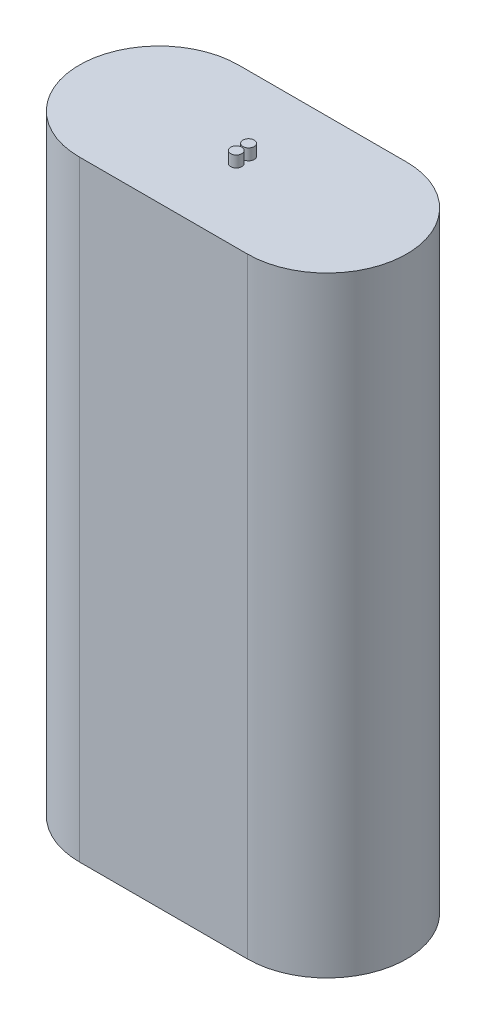
ISO-10303-21;
HEADER;
FILE_DESCRIPTION(('STEP AP214'),'2;1');
FILE_NAME('part.step','',(''),(''),'','','');
FILE_SCHEMA(('AUTOMOTIVE_DESIGN { 1 0 10303 214 1 1 1 1 }'));
ENDSEC;
DATA;
#1=APPLICATION_CONTEXT('core data for automotive mechanical design processes');
#2=APPLICATION_PROTOCOL_DEFINITION('international standard','automotive_design',2000,#1);
#3=PRODUCT_CONTEXT('',#1,'mechanical');
#4=PRODUCT('Part','Part','',(#3));
#5=PRODUCT_RELATED_PRODUCT_CATEGORY('part','',(#4));
#6=PRODUCT_DEFINITION_FORMATION('','',#4);
#7=PRODUCT_DEFINITION_CONTEXT('part definition',#1,'design');
#8=PRODUCT_DEFINITION('design','',#6,#7);
#9=PRODUCT_DEFINITION_SHAPE('','',#8);
#10=(LENGTH_UNIT() NAMED_UNIT(*) SI_UNIT(.MILLI.,.METRE.));
#11=(NAMED_UNIT(*) PLANE_ANGLE_UNIT() SI_UNIT($,.RADIAN.));
#12=(NAMED_UNIT(*) SI_UNIT($,.STERADIAN.) SOLID_ANGLE_UNIT());
#13=UNCERTAINTY_MEASURE_WITH_UNIT(LENGTH_MEASURE(1.E-05),#10,'distance_accuracy_value','');
#14=(GEOMETRIC_REPRESENTATION_CONTEXT(3) GLOBAL_UNCERTAINTY_ASSIGNED_CONTEXT((#13)) GLOBAL_UNIT_ASSIGNED_CONTEXT((#10,
#11,#12)) REPRESENTATION_CONTEXT('',''));
#15=CARTESIAN_POINT('',(0.,0.,0.));
#16=DIRECTION('',(0.,0.,1.));
#17=DIRECTION('',(1.,0.,0.));
#18=AXIS2_PLACEMENT_3D('',#15,#16,#17);
#19=CARTESIAN_POINT('',(0.,69.,-9.));
#20=DIRECTION('',(0.,-1.,0.));
#21=DIRECTION('',(0.,0.,-1.));
#22=AXIS2_PLACEMENT_3D('',#19,#20,#21);
#23=CYLINDRICAL_SURFACE('',#22,9.);
#24=CARTESIAN_POINT('',(0.,0.,-9.));
#25=DIRECTION('',(0.,1.,0.));
#26=DIRECTION('',(0.,0.,1.));
#27=AXIS2_PLACEMENT_3D('',#24,#25,#26);
#28=CIRCLE('',#27,9.);
#29=CARTESIAN_POINT('',(0.,0.,-18.));
#30=VERTEX_POINT('',#29);
#31=CARTESIAN_POINT('',(0.,0.,0.));
#32=VERTEX_POINT('',#31);
#33=EDGE_CURVE('E103',#30,#32,#28,.T.);
#34=ORIENTED_EDGE('',*,*,#33,.T.);
#35=DIRECTION('',(0.,-1.,0.));
#36=VECTOR('',#35,1.);
#37=CARTESIAN_POINT('',(0.,69.,0.));
#38=LINE('',#37,#36);
#39=CARTESIAN_POINT('',(0.,69.,0.));
#40=VERTEX_POINT('',#39);
#41=EDGE_CURVE('E11',#40,#32,#38,.T.);
#42=ORIENTED_EDGE('',*,*,#41,.F.);
#43=CARTESIAN_POINT('',(0.,69.,-9.));
#44=DIRECTION('',(0.,1.,0.));
#45=DIRECTION('',(0.,0.,1.));
#46=AXIS2_PLACEMENT_3D('',#43,#44,#45);
#47=CIRCLE('',#46,9.);
#48=CARTESIAN_POINT('',(0.,69.,-18.));
#49=VERTEX_POINT('',#48);
#50=EDGE_CURVE('E89',#49,#40,#47,.T.);
#51=ORIENTED_EDGE('',*,*,#50,.F.);
#52=DIRECTION('',(0.,-1.,0.));
#53=VECTOR('',#52,1.);
#54=CARTESIAN_POINT('',(0.,69.,-18.));
#55=LINE('',#54,#53);
#56=EDGE_CURVE('E56',#49,#30,#55,.T.);
#57=ORIENTED_EDGE('',*,*,#56,.T.);
#58=EDGE_LOOP('',(#34,#42,#51,#57));
#59=FACE_BOUND('',#58,.T.);
#60=ADVANCED_FACE('F40',(#59),#23,.T.);
#61=CARTESIAN_POINT('',(0.,69.,0.));
#62=DIRECTION('',(0.,0.,-1.));
#63=DIRECTION('',(-1.,0.,0.));
#64=AXIS2_PLACEMENT_3D('',#61,#62,#63);
#65=PLANE('',#64);
#66=DIRECTION('',(1.,0.,0.));
#67=VECTOR('',#66,1.);
#68=CARTESIAN_POINT('',(0.,0.,0.));
#69=LINE('',#68,#67);
#70=CARTESIAN_POINT('',(19.,0.,0.));
#71=VERTEX_POINT('',#70);
#72=EDGE_CURVE('E94',#32,#71,#69,.T.);
#73=ORIENTED_EDGE('',*,*,#72,.T.);
#74=DIRECTION('',(0.,-1.,0.));
#75=VECTOR('',#74,1.);
#76=CARTESIAN_POINT('',(19.,69.,0.));
#77=LINE('',#76,#75);
#78=CARTESIAN_POINT('',(19.,69.,0.));
#79=VERTEX_POINT('',#78);
#80=EDGE_CURVE('E48',#79,#71,#77,.T.);
#81=ORIENTED_EDGE('',*,*,#80,.F.);
#82=DIRECTION('',(1.,0.,0.));
#83=VECTOR('',#82,1.);
#84=CARTESIAN_POINT('',(0.,69.,0.));
#85=LINE('',#84,#83);
#86=EDGE_CURVE('E82',#40,#79,#85,.T.);
#87=ORIENTED_EDGE('',*,*,#86,.F.);
#88=ORIENTED_EDGE('',*,*,#41,.T.);
#89=EDGE_LOOP('',(#73,#81,#87,#88));
#90=FACE_BOUND('',#89,.T.);
#91=ADVANCED_FACE('F93',(#90),#65,.F.);
#92=CARTESIAN_POINT('',(19.,69.,-9.));
#93=DIRECTION('',(0.,-1.,0.));
#94=DIRECTION('',(0.,0.,-1.));
#95=AXIS2_PLACEMENT_3D('',#92,#93,#94);
#96=CYLINDRICAL_SURFACE('',#95,9.);
#97=CARTESIAN_POINT('',(19.,0.,-9.));
#98=DIRECTION('',(0.,1.,0.));
#99=DIRECTION('',(0.,0.,1.));
#100=AXIS2_PLACEMENT_3D('',#97,#98,#99);
#101=CIRCLE('',#100,9.);
#102=CARTESIAN_POINT('',(19.,0.,-18.));
#103=VERTEX_POINT('',#102);
#104=EDGE_CURVE('E107',#71,#103,#101,.T.);
#105=ORIENTED_EDGE('',*,*,#104,.T.);
#106=DIRECTION('',(0.,-1.,0.));
#107=VECTOR('',#106,1.);
#108=CARTESIAN_POINT('',(19.,69.,-18.));
#109=LINE('',#108,#107);
#110=CARTESIAN_POINT('',(19.,69.,-18.));
#111=VERTEX_POINT('',#110);
#112=EDGE_CURVE('E71',#111,#103,#109,.T.);
#113=ORIENTED_EDGE('',*,*,#112,.F.);
#114=CARTESIAN_POINT('',(19.,69.,-9.));
#115=DIRECTION('',(0.,1.,0.));
#116=DIRECTION('',(0.,0.,1.));
#117=AXIS2_PLACEMENT_3D('',#114,#115,#116);
#118=CIRCLE('',#117,9.);
#119=EDGE_CURVE('E88',#79,#111,#118,.T.);
#120=ORIENTED_EDGE('',*,*,#119,.F.);
#121=ORIENTED_EDGE('',*,*,#80,.T.);
#122=EDGE_LOOP('',(#105,#113,#120,#121));
#123=FACE_BOUND('',#122,.T.);
#124=ADVANCED_FACE('F97',(#123),#96,.T.);
#125=CARTESIAN_POINT('',(0.,69.,-18.));
#126=DIRECTION('',(0.,0.,-1.));
#127=DIRECTION('',(-1.,0.,0.));
#128=AXIS2_PLACEMENT_3D('',#125,#126,#127);
#129=PLANE('',#128);
#130=DIRECTION('',(1.,0.,0.));
#131=VECTOR('',#130,1.);
#132=CARTESIAN_POINT('',(0.,0.,-18.));
#133=LINE('',#132,#131);
#134=EDGE_CURVE('E109',#30,#103,#133,.T.);
#135=ORIENTED_EDGE('',*,*,#134,.F.);
#136=ORIENTED_EDGE('',*,*,#56,.F.);
#137=DIRECTION('',(1.,0.,0.));
#138=VECTOR('',#137,1.);
#139=CARTESIAN_POINT('',(0.,69.,-18.));
#140=LINE('',#139,#138);
#141=EDGE_CURVE('E98',#49,#111,#140,.T.);
#142=ORIENTED_EDGE('',*,*,#141,.T.);
#143=ORIENTED_EDGE('',*,*,#112,.T.);
#144=EDGE_LOOP('',(#135,#136,#142,#143));
#145=FACE_BOUND('',#144,.T.);
#146=ADVANCED_FACE('F139',(#145),#129,.T.);
#147=CARTESIAN_POINT('',(0.,69.,0.));
#148=DIRECTION('',(0.,1.,0.));
#149=DIRECTION('',(0.,0.,1.));
#150=AXIS2_PLACEMENT_3D('',#147,#148,#149);
#151=PLANE('',#150);
#152=CARTESIAN_POINT('',(9.5,69.,-8.238));
#153=DIRECTION('',(0.,1.,0.));
#154=DIRECTION('',(0.,0.,1.));
#155=AXIS2_PLACEMENT_3D('',#152,#153,#154);
#156=CIRCLE('',#155,0.635000000000001);
#157=CARTESIAN_POINT('',(9.5,69.,-7.603));
#158=VERTEX_POINT('',#157);
#159=EDGE_CURVE('E121',#158,#158,#156,.T.);
#160=ORIENTED_EDGE('',*,*,#159,.F.);
#161=EDGE_LOOP('',(#160));
#162=FACE_BOUND('',#161,.T.);
#163=CARTESIAN_POINT('',(9.5,69.,-9.635));
#164=DIRECTION('',(0.,1.,0.));
#165=DIRECTION('',(0.,0.,1.));
#166=AXIS2_PLACEMENT_3D('',#163,#164,#165);
#167=CIRCLE('',#166,0.635000000000001);
#168=CARTESIAN_POINT('',(9.5,69.,-9.));
#169=VERTEX_POINT('',#168);
#170=EDGE_CURVE('E115',#169,#169,#167,.T.);
#171=ORIENTED_EDGE('',*,*,#170,.F.);
#172=EDGE_LOOP('',(#171));
#173=FACE_BOUND('',#172,.T.);
#174=ORIENTED_EDGE('',*,*,#50,.T.);
#175=ORIENTED_EDGE('',*,*,#86,.T.);
#176=ORIENTED_EDGE('',*,*,#119,.T.);
#177=ORIENTED_EDGE('',*,*,#141,.F.);
#178=EDGE_LOOP('',(#174,#175,#176,#177));
#179=FACE_BOUND('',#178,.T.);
#180=ADVANCED_FACE('F85',(#162,#173,#179),#151,.T.);
#181=CARTESIAN_POINT('',(0.,0.,0.));
#182=DIRECTION('',(0.,1.,0.));
#183=DIRECTION('',(0.,0.,1.));
#184=AXIS2_PLACEMENT_3D('',#181,#182,#183);
#185=PLANE('',#184);
#186=ORIENTED_EDGE('',*,*,#33,.F.);
#187=ORIENTED_EDGE('',*,*,#134,.T.);
#188=ORIENTED_EDGE('',*,*,#104,.F.);
#189=ORIENTED_EDGE('',*,*,#72,.F.);
#190=EDGE_LOOP('',(#186,#187,#188,#189));
#191=FACE_BOUND('',#190,.T.);
#192=ADVANCED_FACE('F138',(#191),#185,.F.);
#193=CARTESIAN_POINT('',(9.5,70.27,-9.635));
#194=DIRECTION('',(0.,-1.,0.));
#195=DIRECTION('',(0.,0.,-1.));
#196=AXIS2_PLACEMENT_3D('',#193,#194,#195);
#197=CYLINDRICAL_SURFACE('',#196,0.635000000000001);
#198=CARTESIAN_POINT('',(9.5,70.27,-9.635));
#199=DIRECTION('',(0.,1.,0.));
#200=DIRECTION('',(0.,0.,1.));
#201=AXIS2_PLACEMENT_3D('',#198,#199,#200);
#202=CIRCLE('',#201,0.635000000000001);
#203=CARTESIAN_POINT('',(9.5,70.27,-9.));
#204=VERTEX_POINT('',#203);
#205=EDGE_CURVE('E105',#204,#204,#202,.T.);
#206=ORIENTED_EDGE('',*,*,#205,.F.);
#207=EDGE_LOOP('',(#206));
#208=FACE_BOUND('',#207,.T.);
#209=ORIENTED_EDGE('',*,*,#170,.T.);
#210=EDGE_LOOP('',(#209));
#211=FACE_BOUND('',#210,.T.);
#212=ADVANCED_FACE('F143',(#208,#211),#197,.T.);
#213=CARTESIAN_POINT('',(0.,70.27,0.));
#214=DIRECTION('',(0.,1.,0.));
#215=DIRECTION('',(0.,0.,1.));
#216=AXIS2_PLACEMENT_3D('',#213,#214,#215);
#217=PLANE('',#216);
#218=ORIENTED_EDGE('',*,*,#205,.T.);
#219=EDGE_LOOP('',(#218));
#220=FACE_BOUND('',#219,.T.);
#221=ADVANCED_FACE('F132',(#220),#217,.T.);
#222=CARTESIAN_POINT('',(9.5,70.27,-8.238));
#223=DIRECTION('',(0.,-1.,0.));
#224=DIRECTION('',(0.,0.,-1.));
#225=AXIS2_PLACEMENT_3D('',#222,#223,#224);
#226=CYLINDRICAL_SURFACE('',#225,0.635000000000001);
#227=CARTESIAN_POINT('',(9.5,70.27,-8.238));
#228=DIRECTION('',(0.,1.,0.));
#229=DIRECTION('',(0.,0.,1.));
#230=AXIS2_PLACEMENT_3D('',#227,#228,#229);
#231=CIRCLE('',#230,0.635000000000001);
#232=CARTESIAN_POINT('',(9.5,70.27,-7.603));
#233=VERTEX_POINT('',#232);
#234=EDGE_CURVE('E118',#233,#233,#231,.T.);
#235=ORIENTED_EDGE('',*,*,#234,.F.);
#236=EDGE_LOOP('',(#235));
#237=FACE_BOUND('',#236,.T.);
#238=ORIENTED_EDGE('',*,*,#159,.T.);
#239=EDGE_LOOP('',(#238));
#240=FACE_BOUND('',#239,.T.);
#241=ADVANCED_FACE('F129',(#237,#240),#226,.T.);
#242=CARTESIAN_POINT('',(9.5,70.27,-8.238));
#243=DIRECTION('',(0.,1.,0.));
#244=DIRECTION('',(0.,0.,1.));
#245=AXIS2_PLACEMENT_3D('',#242,#243,#244);
#246=PLANE('',#245);
#247=ORIENTED_EDGE('',*,*,#234,.T.);
#248=EDGE_LOOP('',(#247));
#249=FACE_BOUND('',#248,.T.);
#250=ADVANCED_FACE('F127',(#249),#246,.T.);
#251=CLOSED_SHELL('',(#60,#91,#124,#146,#180,#192,#212,#221,#241,#250));
#252=MANIFOLD_SOLID_BREP('B2',#251);
#253=ADVANCED_BREP_SHAPE_REPRESENTATION('',(#18,#252),#14);
#254=SHAPE_DEFINITION_REPRESENTATION(#9,#253);
ENDSEC;
END-ISO-10303-21;
